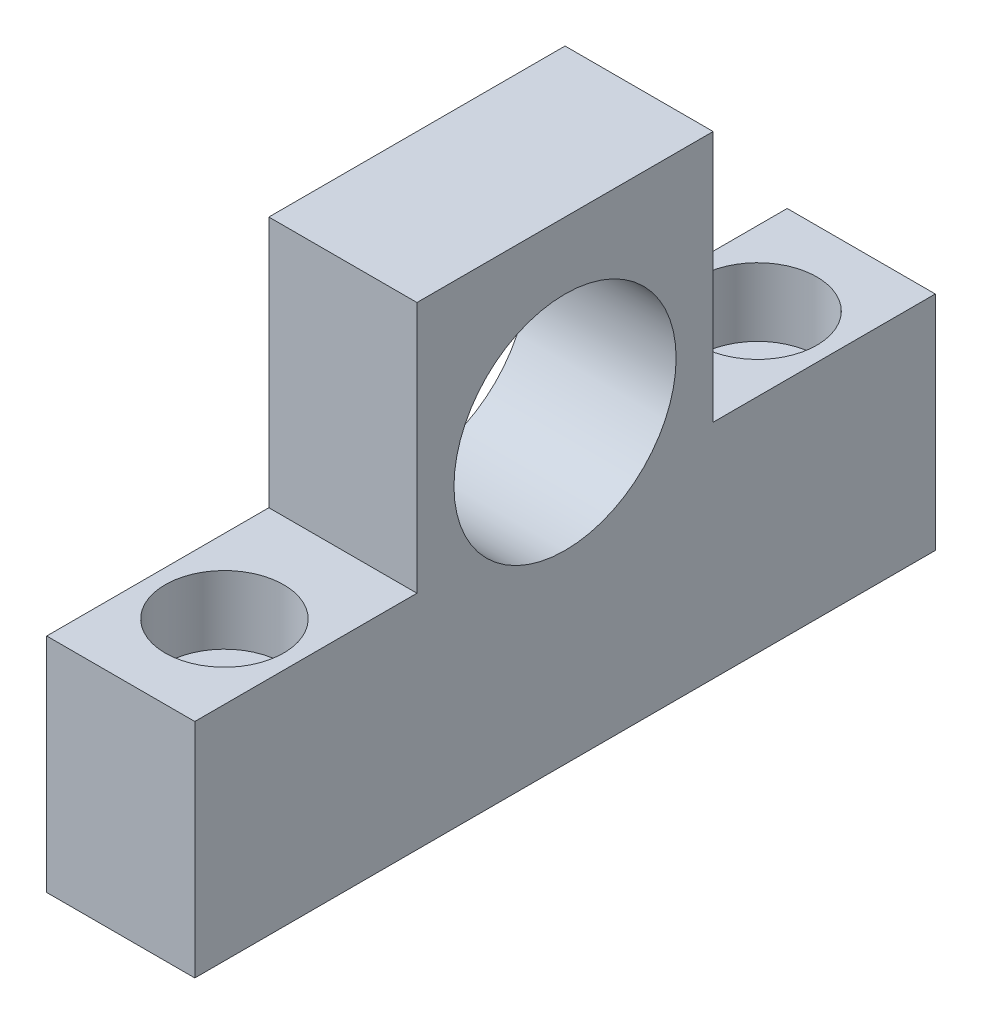
ISO-10303-21;
HEADER;
FILE_DESCRIPTION(('STEP AP214'),'2;1');
FILE_NAME('part.step','',(''),(''),'','','');
FILE_SCHEMA(('AUTOMOTIVE_DESIGN { 1 0 10303 214 1 1 1 1 }'));
ENDSEC;
DATA;
#1=APPLICATION_CONTEXT('core data for automotive mechanical design processes');
#2=APPLICATION_PROTOCOL_DEFINITION('international standard','automotive_design',2000,#1);
#3=PRODUCT_CONTEXT('',#1,'mechanical');
#4=PRODUCT('Part','Part','',(#3));
#5=PRODUCT_RELATED_PRODUCT_CATEGORY('part','',(#4));
#6=PRODUCT_DEFINITION_FORMATION('','',#4);
#7=PRODUCT_DEFINITION_CONTEXT('part definition',#1,'design');
#8=PRODUCT_DEFINITION('design','',#6,#7);
#9=PRODUCT_DEFINITION_SHAPE('','',#8);
#10=(LENGTH_UNIT() NAMED_UNIT(*) SI_UNIT(.MILLI.,.METRE.));
#11=(NAMED_UNIT(*) PLANE_ANGLE_UNIT() SI_UNIT($,.RADIAN.));
#12=(NAMED_UNIT(*) SI_UNIT($,.STERADIAN.) SOLID_ANGLE_UNIT());
#13=UNCERTAINTY_MEASURE_WITH_UNIT(LENGTH_MEASURE(1.E-05),#10,'distance_accuracy_value','');
#14=(GEOMETRIC_REPRESENTATION_CONTEXT(3) GLOBAL_UNCERTAINTY_ASSIGNED_CONTEXT((#13)) GLOBAL_UNIT_ASSIGNED_CONTEXT((#10,
#11,#12)) REPRESENTATION_CONTEXT('',''));
#15=CARTESIAN_POINT('',(0.,0.,0.));
#16=DIRECTION('',(0.,0.,1.));
#17=DIRECTION('',(1.,0.,0.));
#18=AXIS2_PLACEMENT_3D('',#15,#16,#17);
#19=CARTESIAN_POINT('',(10.,0.,0.));
#20=DIRECTION('',(1.,0.,0.));
#21=DIRECTION('',(0.,0.,-1.));
#22=AXIS2_PLACEMENT_3D('',#19,#20,#21);
#23=PLANE('',#22);
#24=DIRECTION('',(0.,-1.,0.));
#25=VECTOR('',#24,1.);
#26=CARTESIAN_POINT('',(10.,15.,0.));
#27=LINE('',#26,#25);
#28=CARTESIAN_POINT('',(10.,15.,0.));
#29=VERTEX_POINT('',#28);
#30=CARTESIAN_POINT('',(10.,0.,0.));
#31=VERTEX_POINT('',#30);
#32=EDGE_CURVE('E166',#29,#31,#27,.T.);
#33=ORIENTED_EDGE('',*,*,#32,.T.);
#34=DIRECTION('',(0.,0.,-1.));
#35=VECTOR('',#34,1.);
#36=CARTESIAN_POINT('',(10.,0.,0.));
#37=LINE('',#36,#35);
#38=CARTESIAN_POINT('',(10.,0.,-50.));
#39=VERTEX_POINT('',#38);
#40=EDGE_CURVE('E101',#31,#39,#37,.T.);
#41=ORIENTED_EDGE('',*,*,#40,.T.);
#42=DIRECTION('',(0.,1.,0.));
#43=VECTOR('',#42,1.);
#44=CARTESIAN_POINT('',(10.,0.,-50.));
#45=LINE('',#44,#43);
#46=CARTESIAN_POINT('',(10.,15.,-50.));
#47=VERTEX_POINT('',#46);
#48=EDGE_CURVE('E188',#39,#47,#45,.T.);
#49=ORIENTED_EDGE('',*,*,#48,.T.);
#50=DIRECTION('',(0.,0.,1.));
#51=VECTOR('',#50,1.);
#52=CARTESIAN_POINT('',(10.,15.,-50.));
#53=LINE('',#52,#51);
#54=CARTESIAN_POINT('',(10.,15.,-35.));
#55=VERTEX_POINT('',#54);
#56=EDGE_CURVE('E202',#47,#55,#53,.T.);
#57=ORIENTED_EDGE('',*,*,#56,.T.);
#58=DIRECTION('',(0.,1.,0.));
#59=VECTOR('',#58,1.);
#60=CARTESIAN_POINT('',(10.,15.,-35.));
#61=LINE('',#60,#59);
#62=CARTESIAN_POINT('',(10.,32.,-35.));
#63=VERTEX_POINT('',#62);
#64=EDGE_CURVE('E120',#55,#63,#61,.T.);
#65=ORIENTED_EDGE('',*,*,#64,.T.);
#66=DIRECTION('',(0.,0.,1.));
#67=VECTOR('',#66,1.);
#68=CARTESIAN_POINT('',(10.,32.,-35.));
#69=LINE('',#68,#67);
#70=CARTESIAN_POINT('',(10.,32.,-15.));
#71=VERTEX_POINT('',#70);
#72=EDGE_CURVE('E114',#63,#71,#69,.T.);
#73=ORIENTED_EDGE('',*,*,#72,.T.);
#74=DIRECTION('',(0.,-1.,0.));
#75=VECTOR('',#74,1.);
#76=CARTESIAN_POINT('',(10.,32.,-15.));
#77=LINE('',#76,#75);
#78=CARTESIAN_POINT('',(10.,15.,-15.));
#79=VERTEX_POINT('',#78);
#80=EDGE_CURVE('E118',#71,#79,#77,.T.);
#81=ORIENTED_EDGE('',*,*,#80,.T.);
#82=DIRECTION('',(0.,0.,1.));
#83=VECTOR('',#82,1.);
#84=CARTESIAN_POINT('',(10.,15.,-15.));
#85=LINE('',#84,#83);
#86=EDGE_CURVE('E58',#79,#29,#85,.T.);
#87=ORIENTED_EDGE('',*,*,#86,.T.);
#88=EDGE_LOOP('',(#33,#41,#49,#57,#65,#73,#81,#87));
#89=FACE_BOUND('',#88,.T.);
#90=CARTESIAN_POINT('',(10.,20.,-25.));
#91=DIRECTION('',(1.,0.,0.));
#92=DIRECTION('',(0.,0.,-1.));
#93=AXIS2_PLACEMENT_3D('',#90,#91,#92);
#94=CIRCLE('',#93,7.5);
#95=CARTESIAN_POINT('',(10.,20.,-32.5));
#96=VERTEX_POINT('',#95);
#97=EDGE_CURVE('E148',#96,#96,#94,.T.);
#98=ORIENTED_EDGE('',*,*,#97,.F.);
#99=EDGE_LOOP('',(#98));
#100=FACE_BOUND('',#99,.T.);
#101=ADVANCED_FACE('F40',(#89,#100),#23,.T.);
#102=CARTESIAN_POINT('',(0.,0.,0.));
#103=DIRECTION('',(1.,0.,0.));
#104=DIRECTION('',(0.,0.,-1.));
#105=AXIS2_PLACEMENT_3D('',#102,#103,#104);
#106=PLANE('',#105);
#107=DIRECTION('',(0.,-1.,0.));
#108=VECTOR('',#107,1.);
#109=CARTESIAN_POINT('',(0.,15.,0.));
#110=LINE('',#109,#108);
#111=CARTESIAN_POINT('',(0.,15.,0.));
#112=VERTEX_POINT('',#111);
#113=CARTESIAN_POINT('',(0.,0.,0.));
#114=VERTEX_POINT('',#113);
#115=EDGE_CURVE('E143',#112,#114,#110,.T.);
#116=ORIENTED_EDGE('',*,*,#115,.F.);
#117=DIRECTION('',(0.,0.,1.));
#118=VECTOR('',#117,1.);
#119=CARTESIAN_POINT('',(0.,15.,-15.));
#120=LINE('',#119,#118);
#121=CARTESIAN_POINT('',(0.,15.,-15.));
#122=VERTEX_POINT('',#121);
#123=EDGE_CURVE('E93',#122,#112,#120,.T.);
#124=ORIENTED_EDGE('',*,*,#123,.F.);
#125=DIRECTION('',(0.,-1.,0.));
#126=VECTOR('',#125,1.);
#127=CARTESIAN_POINT('',(0.,32.,-15.));
#128=LINE('',#127,#126);
#129=CARTESIAN_POINT('',(0.,32.,-15.));
#130=VERTEX_POINT('',#129);
#131=EDGE_CURVE('E87',#130,#122,#128,.T.);
#132=ORIENTED_EDGE('',*,*,#131,.F.);
#133=DIRECTION('',(0.,0.,1.));
#134=VECTOR('',#133,1.);
#135=CARTESIAN_POINT('',(0.,32.,-35.));
#136=LINE('',#135,#134);
#137=CARTESIAN_POINT('',(0.,32.,-35.));
#138=VERTEX_POINT('',#137);
#139=EDGE_CURVE('E129',#138,#130,#136,.T.);
#140=ORIENTED_EDGE('',*,*,#139,.F.);
#141=DIRECTION('',(0.,1.,0.));
#142=VECTOR('',#141,1.);
#143=CARTESIAN_POINT('',(0.,15.,-35.));
#144=LINE('',#143,#142);
#145=CARTESIAN_POINT('',(0.,15.,-35.));
#146=VERTEX_POINT('',#145);
#147=EDGE_CURVE('E157',#146,#138,#144,.T.);
#148=ORIENTED_EDGE('',*,*,#147,.F.);
#149=DIRECTION('',(0.,0.,1.));
#150=VECTOR('',#149,1.);
#151=CARTESIAN_POINT('',(0.,15.,-50.));
#152=LINE('',#151,#150);
#153=CARTESIAN_POINT('',(0.,15.,-50.));
#154=VERTEX_POINT('',#153);
#155=EDGE_CURVE('E154',#154,#146,#152,.T.);
#156=ORIENTED_EDGE('',*,*,#155,.F.);
#157=DIRECTION('',(0.,1.,0.));
#158=VECTOR('',#157,1.);
#159=CARTESIAN_POINT('',(0.,0.,-50.));
#160=LINE('',#159,#158);
#161=CARTESIAN_POINT('',(0.,0.,-50.));
#162=VERTEX_POINT('',#161);
#163=EDGE_CURVE('E151',#162,#154,#160,.T.);
#164=ORIENTED_EDGE('',*,*,#163,.F.);
#165=DIRECTION('',(0.,0.,-1.));
#166=VECTOR('',#165,1.);
#167=CARTESIAN_POINT('',(0.,0.,0.));
#168=LINE('',#167,#166);
#169=EDGE_CURVE('E147',#114,#162,#168,.T.);
#170=ORIENTED_EDGE('',*,*,#169,.F.);
#171=EDGE_LOOP('',(#116,#124,#132,#140,#148,#156,#164,#170));
#172=FACE_BOUND('',#171,.T.);
#173=CARTESIAN_POINT('',(0.,20.,-25.));
#174=DIRECTION('',(1.,0.,0.));
#175=DIRECTION('',(0.,0.,-1.));
#176=AXIS2_PLACEMENT_3D('',#173,#174,#175);
#177=CIRCLE('',#176,7.5);
#178=CARTESIAN_POINT('',(0.,20.,-32.5));
#179=VERTEX_POINT('',#178);
#180=EDGE_CURVE('E213',#179,#179,#177,.T.);
#181=ORIENTED_EDGE('',*,*,#180,.T.);
#182=EDGE_LOOP('',(#181));
#183=FACE_BOUND('',#182,.T.);
#184=ADVANCED_FACE('F192',(#172,#183),#106,.F.);
#185=CARTESIAN_POINT('',(10.,15.,0.));
#186=DIRECTION('',(0.,0.,-1.));
#187=DIRECTION('',(0.,1.,0.));
#188=AXIS2_PLACEMENT_3D('',#185,#186,#187);
#189=PLANE('',#188);
#190=ORIENTED_EDGE('',*,*,#115,.T.);
#191=DIRECTION('',(-1.,0.,0.));
#192=VECTOR('',#191,1.);
#193=CARTESIAN_POINT('',(10.,0.,0.));
#194=LINE('',#193,#192);
#195=EDGE_CURVE('E11',#31,#114,#194,.T.);
#196=ORIENTED_EDGE('',*,*,#195,.F.);
#197=ORIENTED_EDGE('',*,*,#32,.F.);
#198=DIRECTION('',(-1.,0.,0.));
#199=VECTOR('',#198,1.);
#200=CARTESIAN_POINT('',(10.,15.,0.));
#201=LINE('',#200,#199);
#202=EDGE_CURVE('E139',#29,#112,#201,.T.);
#203=ORIENTED_EDGE('',*,*,#202,.T.);
#204=EDGE_LOOP('',(#190,#196,#197,#203));
#205=FACE_BOUND('',#204,.T.);
#206=ADVANCED_FACE('F42',(#205),#189,.F.);
#207=CARTESIAN_POINT('',(10.,0.,0.));
#208=DIRECTION('',(0.,1.,0.));
#209=DIRECTION('',(0.,0.,1.));
#210=AXIS2_PLACEMENT_3D('',#207,#208,#209);
#211=PLANE('',#210);
#212=CARTESIAN_POINT('',(5.,0.,-43.));
#213=DIRECTION('',(0.,1.,0.));
#214=DIRECTION('',(0.,0.,1.));
#215=AXIS2_PLACEMENT_3D('',#212,#213,#214);
#216=CIRCLE('',#215,2.25);
#217=CARTESIAN_POINT('',(5.,0.,-40.75));
#218=VERTEX_POINT('',#217);
#219=EDGE_CURVE('E236',#218,#218,#216,.T.);
#220=ORIENTED_EDGE('',*,*,#219,.T.);
#221=EDGE_LOOP('',(#220));
#222=FACE_BOUND('',#221,.T.);
#223=CARTESIAN_POINT('',(5.,0.,-7.00000000000001));
#224=DIRECTION('',(0.,1.,0.));
#225=DIRECTION('',(0.,0.,1.));
#226=AXIS2_PLACEMENT_3D('',#223,#224,#225);
#227=CIRCLE('',#226,2.25);
#228=CARTESIAN_POINT('',(5.,0.,-4.75000000000002));
#229=VERTEX_POINT('',#228);
#230=EDGE_CURVE('E217',#229,#229,#227,.T.);
#231=ORIENTED_EDGE('',*,*,#230,.T.);
#232=EDGE_LOOP('',(#231));
#233=FACE_BOUND('',#232,.T.);
#234=ORIENTED_EDGE('',*,*,#169,.T.);
#235=DIRECTION('',(-1.,0.,0.));
#236=VECTOR('',#235,1.);
#237=CARTESIAN_POINT('',(10.,0.,-50.));
#238=LINE('',#237,#236);
#239=EDGE_CURVE('E50',#39,#162,#238,.T.);
#240=ORIENTED_EDGE('',*,*,#239,.F.);
#241=ORIENTED_EDGE('',*,*,#40,.F.);
#242=ORIENTED_EDGE('',*,*,#195,.T.);
#243=EDGE_LOOP('',(#234,#240,#241,#242));
#244=FACE_BOUND('',#243,.T.);
#245=ADVANCED_FACE('F263',(#222,#233,#244),#211,.F.);
#246=CARTESIAN_POINT('',(10.,0.,-50.));
#247=DIRECTION('',(0.,0.,1.));
#248=DIRECTION('',(1.,0.,0.));
#249=AXIS2_PLACEMENT_3D('',#246,#247,#248);
#250=PLANE('',#249);
#251=ORIENTED_EDGE('',*,*,#163,.T.);
#252=DIRECTION('',(-1.,0.,0.));
#253=VECTOR('',#252,1.);
#254=CARTESIAN_POINT('',(10.,15.,-50.));
#255=LINE('',#254,#253);
#256=EDGE_CURVE('E177',#47,#154,#255,.T.);
#257=ORIENTED_EDGE('',*,*,#256,.F.);
#258=ORIENTED_EDGE('',*,*,#48,.F.);
#259=ORIENTED_EDGE('',*,*,#239,.T.);
#260=EDGE_LOOP('',(#251,#257,#258,#259));
#261=FACE_BOUND('',#260,.T.);
#262=ADVANCED_FACE('F186',(#261),#250,.F.);
#263=CARTESIAN_POINT('',(10.,15.,-50.));
#264=DIRECTION('',(0.,-1.,0.));
#265=DIRECTION('',(0.,0.,-1.));
#266=AXIS2_PLACEMENT_3D('',#263,#264,#265);
#267=PLANE('',#266);
#268=CARTESIAN_POINT('',(5.,15.,-43.));
#269=DIRECTION('',(0.,1.,0.));
#270=DIRECTION('',(0.,0.,1.));
#271=AXIS2_PLACEMENT_3D('',#268,#269,#270);
#272=CIRCLE('',#271,3.99999999999999);
#273=CARTESIAN_POINT('',(5.,15.,-39.));
#274=VERTEX_POINT('',#273);
#275=EDGE_CURVE('E248',#274,#274,#272,.T.);
#276=ORIENTED_EDGE('',*,*,#275,.F.);
#277=EDGE_LOOP('',(#276));
#278=FACE_BOUND('',#277,.T.);
#279=ORIENTED_EDGE('',*,*,#155,.T.);
#280=DIRECTION('',(-1.,0.,0.));
#281=VECTOR('',#280,1.);
#282=CARTESIAN_POINT('',(10.,15.,-35.));
#283=LINE('',#282,#281);
#284=EDGE_CURVE('E173',#55,#146,#283,.T.);
#285=ORIENTED_EDGE('',*,*,#284,.F.);
#286=ORIENTED_EDGE('',*,*,#56,.F.);
#287=ORIENTED_EDGE('',*,*,#256,.T.);
#288=EDGE_LOOP('',(#279,#285,#286,#287));
#289=FACE_BOUND('',#288,.T.);
#290=ADVANCED_FACE('F197',(#278,#289),#267,.F.);
#291=CARTESIAN_POINT('',(10.,15.,-35.));
#292=DIRECTION('',(0.,0.,1.));
#293=DIRECTION('',(1.,0.,0.));
#294=AXIS2_PLACEMENT_3D('',#291,#292,#293);
#295=PLANE('',#294);
#296=ORIENTED_EDGE('',*,*,#147,.T.);
#297=DIRECTION('',(-1.,0.,0.));
#298=VECTOR('',#297,1.);
#299=CARTESIAN_POINT('',(10.,32.,-35.));
#300=LINE('',#299,#298);
#301=EDGE_CURVE('E131',#63,#138,#300,.T.);
#302=ORIENTED_EDGE('',*,*,#301,.F.);
#303=ORIENTED_EDGE('',*,*,#64,.F.);
#304=ORIENTED_EDGE('',*,*,#284,.T.);
#305=EDGE_LOOP('',(#296,#302,#303,#304));
#306=FACE_BOUND('',#305,.T.);
#307=ADVANCED_FACE('F200',(#306),#295,.F.);
#308=CARTESIAN_POINT('',(10.,32.,-35.));
#309=DIRECTION('',(0.,-1.,0.));
#310=DIRECTION('',(0.,0.,-1.));
#311=AXIS2_PLACEMENT_3D('',#308,#309,#310);
#312=PLANE('',#311);
#313=ORIENTED_EDGE('',*,*,#139,.T.);
#314=DIRECTION('',(-1.,0.,0.));
#315=VECTOR('',#314,1.);
#316=CARTESIAN_POINT('',(10.,32.,-15.));
#317=LINE('',#316,#315);
#318=EDGE_CURVE('E126',#71,#130,#317,.T.);
#319=ORIENTED_EDGE('',*,*,#318,.F.);
#320=ORIENTED_EDGE('',*,*,#72,.F.);
#321=ORIENTED_EDGE('',*,*,#301,.T.);
#322=EDGE_LOOP('',(#313,#319,#320,#321));
#323=FACE_BOUND('',#322,.T.);
#324=ADVANCED_FACE('F127',(#323),#312,.F.);
#325=CARTESIAN_POINT('',(10.,32.,-15.));
#326=DIRECTION('',(0.,0.,-1.));
#327=DIRECTION('',(-1.,0.,0.));
#328=AXIS2_PLACEMENT_3D('',#325,#326,#327);
#329=PLANE('',#328);
#330=ORIENTED_EDGE('',*,*,#131,.T.);
#331=DIRECTION('',(-1.,0.,0.));
#332=VECTOR('',#331,1.);
#333=CARTESIAN_POINT('',(10.,15.,-15.));
#334=LINE('',#333,#332);
#335=EDGE_CURVE('E132',#79,#122,#334,.T.);
#336=ORIENTED_EDGE('',*,*,#335,.F.);
#337=ORIENTED_EDGE('',*,*,#80,.F.);
#338=ORIENTED_EDGE('',*,*,#318,.T.);
#339=EDGE_LOOP('',(#330,#336,#337,#338));
#340=FACE_BOUND('',#339,.T.);
#341=ADVANCED_FACE('F134',(#340),#329,.F.);
#342=CARTESIAN_POINT('',(10.,15.,-15.));
#343=DIRECTION('',(0.,-1.,0.));
#344=DIRECTION('',(0.,0.,-1.));
#345=AXIS2_PLACEMENT_3D('',#342,#343,#344);
#346=PLANE('',#345);
#347=CARTESIAN_POINT('',(5.,15.,-7.00000000000001));
#348=DIRECTION('',(0.,1.,0.));
#349=DIRECTION('',(0.,0.,1.));
#350=AXIS2_PLACEMENT_3D('',#347,#348,#349);
#351=CIRCLE('',#350,3.99999999999999);
#352=CARTESIAN_POINT('',(5.,15.,-3.00000000000002));
#353=VERTEX_POINT('',#352);
#354=EDGE_CURVE('E232',#353,#353,#351,.T.);
#355=ORIENTED_EDGE('',*,*,#354,.F.);
#356=EDGE_LOOP('',(#355));
#357=FACE_BOUND('',#356,.T.);
#358=ORIENTED_EDGE('',*,*,#123,.T.);
#359=ORIENTED_EDGE('',*,*,#202,.F.);
#360=ORIENTED_EDGE('',*,*,#86,.F.);
#361=ORIENTED_EDGE('',*,*,#335,.T.);
#362=EDGE_LOOP('',(#358,#359,#360,#361));
#363=FACE_BOUND('',#362,.T.);
#364=ADVANCED_FACE('F275',(#357,#363),#346,.F.);
#365=CARTESIAN_POINT('',(10.,20.,-25.));
#366=DIRECTION('',(-1.,0.,0.));
#367=DIRECTION('',(0.,0.,1.));
#368=AXIS2_PLACEMENT_3D('',#365,#366,#367);
#369=CYLINDRICAL_SURFACE('',#368,7.5);
#370=ORIENTED_EDGE('',*,*,#97,.T.);
#371=EDGE_LOOP('',(#370));
#372=FACE_BOUND('',#371,.T.);
#373=ORIENTED_EDGE('',*,*,#180,.F.);
#374=EDGE_LOOP('',(#373));
#375=FACE_BOUND('',#374,.T.);
#376=ADVANCED_FACE('F272',(#372,#375),#369,.F.);
#377=CARTESIAN_POINT('',(5.,15.,-7.00000000000001));
#378=DIRECTION('',(0.,1.,0.));
#379=DIRECTION('',(0.,0.,1.));
#380=AXIS2_PLACEMENT_3D('',#377,#378,#379);
#381=CYLINDRICAL_SURFACE('',#380,2.25);
#382=ORIENTED_EDGE('',*,*,#230,.F.);
#383=EDGE_LOOP('',(#382));
#384=FACE_BOUND('',#383,.T.);
#385=CARTESIAN_POINT('',(5.,10.4,-7.00000000000001));
#386=DIRECTION('',(0.,1.,0.));
#387=DIRECTION('',(0.,0.,1.));
#388=AXIS2_PLACEMENT_3D('',#385,#386,#387);
#389=CIRCLE('',#388,2.25000000000001);
#390=CARTESIAN_POINT('',(5.,10.4,-4.75));
#391=VERTEX_POINT('',#390);
#392=EDGE_CURVE('E224',#391,#391,#389,.T.);
#393=ORIENTED_EDGE('',*,*,#392,.T.);
#394=EDGE_LOOP('',(#393));
#395=FACE_BOUND('',#394,.T.);
#396=ADVANCED_FACE('F301',(#384,#395),#381,.F.);
#397=CARTESIAN_POINT('',(7.25000000000001,10.4,-7.00000000000001));
#398=DIRECTION('',(0.,-1.,0.));
#399=DIRECTION('',(0.,0.,-1.));
#400=AXIS2_PLACEMENT_3D('',#397,#398,#399);
#401=PLANE('',#400);
#402=ORIENTED_EDGE('',*,*,#392,.F.);
#403=EDGE_LOOP('',(#402));
#404=FACE_BOUND('',#403,.T.);
#405=CARTESIAN_POINT('',(5.,10.4,-7.00000000000001));
#406=DIRECTION('',(0.,1.,0.));
#407=DIRECTION('',(0.,0.,1.));
#408=AXIS2_PLACEMENT_3D('',#405,#406,#407);
#409=CIRCLE('',#408,3.99999999999999);
#410=CARTESIAN_POINT('',(5.,10.4,-3.00000000000002));
#411=VERTEX_POINT('',#410);
#412=EDGE_CURVE('E228',#411,#411,#409,.T.);
#413=ORIENTED_EDGE('',*,*,#412,.T.);
#414=EDGE_LOOP('',(#413));
#415=FACE_BOUND('',#414,.T.);
#416=ADVANCED_FACE('F308',(#404,#415),#401,.F.);
#417=CARTESIAN_POINT('',(5.,15.,-7.00000000000001));
#418=DIRECTION('',(0.,1.,0.));
#419=DIRECTION('',(0.,0.,1.));
#420=AXIS2_PLACEMENT_3D('',#417,#418,#419);
#421=CYLINDRICAL_SURFACE('',#420,3.99999999999999);
#422=ORIENTED_EDGE('',*,*,#412,.F.);
#423=EDGE_LOOP('',(#422));
#424=FACE_BOUND('',#423,.T.);
#425=ORIENTED_EDGE('',*,*,#354,.T.);
#426=EDGE_LOOP('',(#425));
#427=FACE_BOUND('',#426,.T.);
#428=ADVANCED_FACE('F315',(#424,#427),#421,.F.);
#429=CARTESIAN_POINT('',(5.,15.,-43.));
#430=DIRECTION('',(0.,1.,0.));
#431=DIRECTION('',(0.,0.,1.));
#432=AXIS2_PLACEMENT_3D('',#429,#430,#431);
#433=CYLINDRICAL_SURFACE('',#432,2.25);
#434=ORIENTED_EDGE('',*,*,#219,.F.);
#435=EDGE_LOOP('',(#434));
#436=FACE_BOUND('',#435,.T.);
#437=CARTESIAN_POINT('',(5.,10.4,-43.));
#438=DIRECTION('',(0.,1.,0.));
#439=DIRECTION('',(0.,0.,1.));
#440=AXIS2_PLACEMENT_3D('',#437,#438,#439);
#441=CIRCLE('',#440,2.25000000000001);
#442=CARTESIAN_POINT('',(5.,10.4,-40.75));
#443=VERTEX_POINT('',#442);
#444=EDGE_CURVE('E240',#443,#443,#441,.T.);
#445=ORIENTED_EDGE('',*,*,#444,.T.);
#446=EDGE_LOOP('',(#445));
#447=FACE_BOUND('',#446,.T.);
#448=ADVANCED_FACE('F323',(#436,#447),#433,.F.);
#449=CARTESIAN_POINT('',(7.25000000000001,10.4,-43.));
#450=DIRECTION('',(0.,-1.,0.));
#451=DIRECTION('',(0.,0.,-1.));
#452=AXIS2_PLACEMENT_3D('',#449,#450,#451);
#453=PLANE('',#452);
#454=ORIENTED_EDGE('',*,*,#444,.F.);
#455=EDGE_LOOP('',(#454));
#456=FACE_BOUND('',#455,.T.);
#457=CARTESIAN_POINT('',(5.,10.4,-43.));
#458=DIRECTION('',(0.,1.,0.));
#459=DIRECTION('',(0.,0.,1.));
#460=AXIS2_PLACEMENT_3D('',#457,#458,#459);
#461=CIRCLE('',#460,3.99999999999999);
#462=CARTESIAN_POINT('',(5.,10.4,-39.));
#463=VERTEX_POINT('',#462);
#464=EDGE_CURVE('E244',#463,#463,#461,.T.);
#465=ORIENTED_EDGE('',*,*,#464,.T.);
#466=EDGE_LOOP('',(#465));
#467=FACE_BOUND('',#466,.T.);
#468=ADVANCED_FACE('F331',(#456,#467),#453,.F.);
#469=CARTESIAN_POINT('',(5.,15.,-43.));
#470=DIRECTION('',(0.,1.,0.));
#471=DIRECTION('',(0.,0.,1.));
#472=AXIS2_PLACEMENT_3D('',#469,#470,#471);
#473=CYLINDRICAL_SURFACE('',#472,3.99999999999999);
#474=ORIENTED_EDGE('',*,*,#464,.F.);
#475=EDGE_LOOP('',(#474));
#476=FACE_BOUND('',#475,.T.);
#477=ORIENTED_EDGE('',*,*,#275,.T.);
#478=EDGE_LOOP('',(#477));
#479=FACE_BOUND('',#478,.T.);
#480=ADVANCED_FACE('F254',(#476,#479),#473,.F.);
#481=CLOSED_SHELL('',(#101,#184,#206,#245,#262,#290,#307,#324,#341,#364,#376,#396,#416,#428,
#448,#468,#480));
#482=MANIFOLD_SOLID_BREP('B2',#481);
#483=ADVANCED_BREP_SHAPE_REPRESENTATION('',(#18,#482),#14);
#484=SHAPE_DEFINITION_REPRESENTATION(#9,#483);
ENDSEC;
END-ISO-10303-21;
